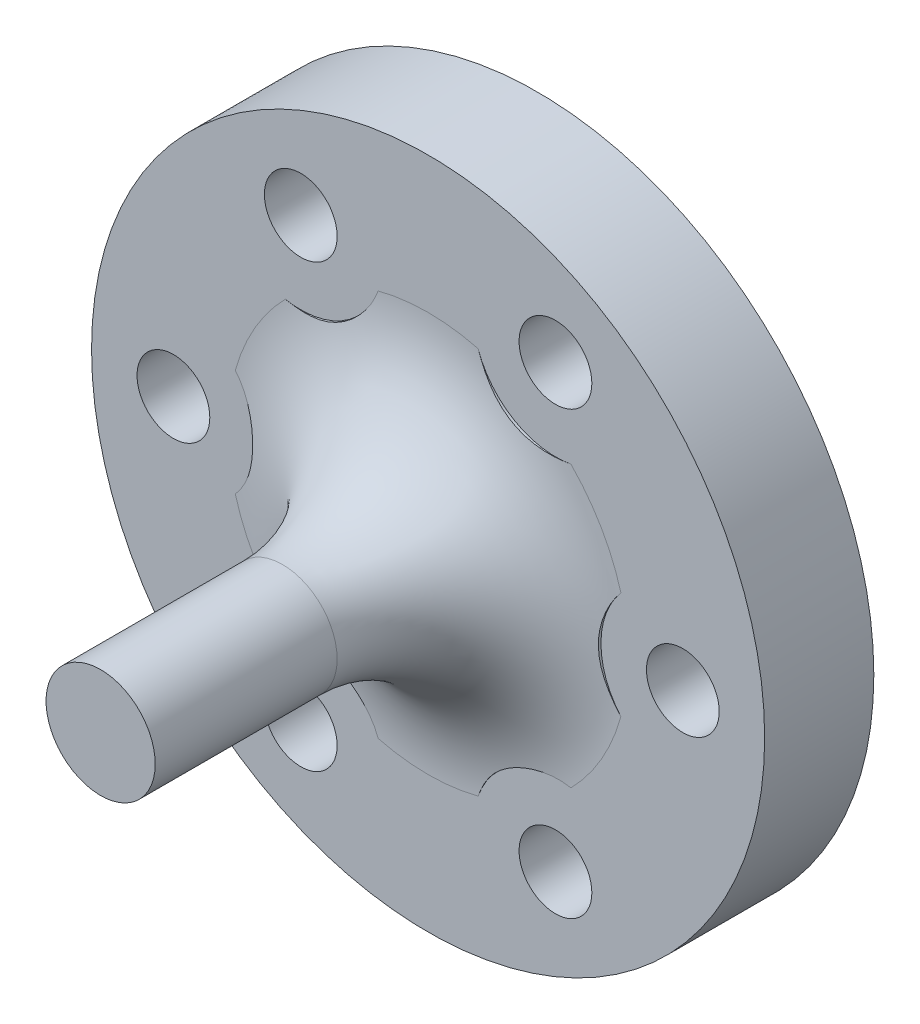
ISO-10303-21;
HEADER;
FILE_DESCRIPTION(('STEP AP214'),'2;1');
FILE_NAME('part.step','',(''),(''),'','','');
FILE_SCHEMA(('AUTOMOTIVE_DESIGN { 1 0 10303 214 1 1 1 1 }'));
ENDSEC;
DATA;
#1=APPLICATION_CONTEXT('core data for automotive mechanical design processes');
#2=APPLICATION_PROTOCOL_DEFINITION('international standard','automotive_design',2000,#1);
#3=PRODUCT_CONTEXT('',#1,'mechanical');
#4=PRODUCT('Part','Part','',(#3));
#5=PRODUCT_RELATED_PRODUCT_CATEGORY('part','',(#4));
#6=PRODUCT_DEFINITION_FORMATION('','',#4);
#7=PRODUCT_DEFINITION_CONTEXT('part definition',#1,'design');
#8=PRODUCT_DEFINITION('design','',#6,#7);
#9=PRODUCT_DEFINITION_SHAPE('','',#8);
#10=(LENGTH_UNIT() NAMED_UNIT(*) SI_UNIT(.MILLI.,.METRE.));
#11=(NAMED_UNIT(*) PLANE_ANGLE_UNIT() SI_UNIT($,.RADIAN.));
#12=(NAMED_UNIT(*) SI_UNIT($,.STERADIAN.) SOLID_ANGLE_UNIT());
#13=UNCERTAINTY_MEASURE_WITH_UNIT(LENGTH_MEASURE(1.E-05),#10,'distance_accuracy_value','');
#14=(GEOMETRIC_REPRESENTATION_CONTEXT(3) GLOBAL_UNCERTAINTY_ASSIGNED_CONTEXT((#13)) GLOBAL_UNIT_ASSIGNED_CONTEXT((#10,
#11,#12)) REPRESENTATION_CONTEXT('',''));
#15=CARTESIAN_POINT('',(0.,0.,0.));
#16=DIRECTION('',(0.,0.,1.));
#17=DIRECTION('',(1.,0.,0.));
#18=AXIS2_PLACEMENT_3D('',#15,#16,#17);
#19=CARTESIAN_POINT('',(0.,0.,14.));
#20=DIRECTION('',(0.,0.,1.));
#21=DIRECTION('',(1.,0.,0.));
#22=AXIS2_PLACEMENT_3D('',#19,#20,#21);
#23=TOROIDAL_SURFACE('',#22,11.,8.);
#24=CARTESIAN_POINT('',(0.,0.,14.));
#25=DIRECTION('',(0.,0.,1.));
#26=DIRECTION('',(1.,0.,0.));
#27=AXIS2_PLACEMENT_3D('',#24,#25,#26);
#28=CIRCLE('',#27,3.);
#29=CARTESIAN_POINT('',(3.,0.,14.));
#30=VERTEX_POINT('',#29);
#31=EDGE_CURVE('E132',#30,#30,#28,.T.);
#32=ORIENTED_EDGE('',*,*,#31,.F.);
#33=EDGE_LOOP('',(#32));
#34=FACE_BOUND('',#33,.T.);
#35=CARTESIAN_POINT('',(-11.0001999999998,10.0631909434061,7.01993479948627));
#36=CARTESIAN_POINT('',(-10.9494264124712,9.96463682163105,6.96169340146558));
#37=CARTESIAN_POINT('',(-10.8945383605836,9.86707400444641,6.90528345397473));
#38=CARTESIAN_POINT('',(-10.7764532518473,9.67463319364013,6.79652438119807));
#39=CARTESIAN_POINT('',(-10.7132498095846,9.57975733208057,6.74417842628928));
#40=CARTESIAN_POINT('',(-10.5782294989667,9.39312894186151,6.64381160764316));
#41=CARTESIAN_POINT('',(-10.5063752029488,9.30139236329559,6.59581123529545));
#42=CARTESIAN_POINT('',(-10.3544051656952,9.12239896591814,6.50485031696125));
#43=CARTESIAN_POINT('',(-10.2742913967551,9.03514108504984,6.46188857300459));
#44=CARTESIAN_POINT('',(-10.1056029574734,8.86558247842679,6.38118510661778));
#45=CARTESIAN_POINT('',(-10.0169871973044,8.78330932132801,6.34347114075104));
#46=CARTESIAN_POINT('',(-9.83207157533709,8.62518916081575,6.27385985212408));
#47=CARTESIAN_POINT('',(-9.73577237457533,8.54934160573764,6.24196202975226));
#48=CARTESIAN_POINT('',(-9.53634628390853,8.40521005328183,6.18427217205492));
#49=CARTESIAN_POINT('',(-9.43323761218836,8.33690708426461,6.15846462715958));
#50=CARTESIAN_POINT('',(-9.22075288700532,8.20853397885126,6.11291648236378));
#51=CARTESIAN_POINT('',(-9.11137750414056,8.14846296388191,6.09317523474471));
#52=CARTESIAN_POINT('',(-8.89750957578134,8.04239789602259,6.06116443542952));
#53=CARTESIAN_POINT('',(-8.79348194963406,7.99561955554907,6.04837753050059));
#54=CARTESIAN_POINT('',(-8.5817346591249,7.90995607816692,6.02746344237483));
#55=CARTESIAN_POINT('',(-8.47401382356204,7.87107347275026,6.01933775211487));
#56=CARTESIAN_POINT('',(-8.25565941551487,7.80157323416832,6.0073701332852));
#57=CARTESIAN_POINT('',(-8.14502472151908,7.77095883591157,6.00352987954324));
#58=CARTESIAN_POINT('',(-7.92166365113584,7.71825481410896,5.99961325188039));
#59=CARTESIAN_POINT('',(-7.80893651389783,7.69616835774164,5.99953827500793));
#60=CARTESIAN_POINT('',(-7.47004732152016,7.64316704419308,6.00402431957029));
#61=CARTESIAN_POINT('',(-7.24182026468586,7.62507998139504,6.01323761632444));
#62=CARTESIAN_POINT('',(-6.78561738554907,7.6236731456313,6.038092838136));
#63=CARTESIAN_POINT('',(-6.55764168931558,7.64036639330784,6.05373716900813));
#64=CARTESIAN_POINT('',(-6.20947405427308,7.69259094118926,6.07775651141392));
#65=CARTESIAN_POINT('',(-6.08737519547192,7.71611619128904,6.08620462795984));
#66=CARTESIAN_POINT('',(-5.84549169936305,7.77320239967545,6.1020512693898));
#67=CARTESIAN_POINT('',(-5.72570630013189,7.80675999173071,6.10945014510814));
#68=CARTESIAN_POINT('',(-5.48926754275764,7.88370211807641,6.12233759782229));
#69=CARTESIAN_POINT('',(-5.37261333104627,7.92708394319498,6.12782670040872));
#70=CARTESIAN_POINT('',(-5.14322078020805,8.02339935554509,6.13626139696227));
#71=CARTESIAN_POINT('',(-5.03048230747868,8.07633261650523,6.13920707779129));
#72=CARTESIAN_POINT('',(-4.80930324162474,8.19161331449289,6.14221690821589));
#73=CARTESIAN_POINT('',(-4.70088185711465,8.25399792964961,6.14226936549766));
#74=CARTESIAN_POINT('',(-4.48963429765387,8.38755456749725,6.13945757813633));
#75=CARTESIAN_POINT('',(-4.38680825001812,8.45872679001891,6.13659326715501));
#76=CARTESIAN_POINT('',(-4.18741757865615,8.60938742070654,6.12827943277813));
#77=CARTESIAN_POINT('',(-4.09085803445245,8.68888244211004,6.12282784120864));
#78=CARTESIAN_POINT('',(-3.90477770337695,8.85553100301752,6.10998559378254));
#79=CARTESIAN_POINT('',(-3.81525683937263,8.94268445857534,6.10259495917854));
#80=CARTESIAN_POINT('',(-3.56038180963211,9.21238222531372,6.07898728665461));
#81=CARTESIAN_POINT('',(-3.40591888389211,9.40528766729484,6.06117485459986));
#82=CARTESIAN_POINT('',(-3.13071732813855,9.8136919172711,6.02937607782936));
#83=CARTESIAN_POINT('',(-3.00992445280466,10.0291536056385,6.01538357963299));
#84=CARTESIAN_POINT('',(-2.85251325935254,10.3733892191976,6.00301981580388));
#85=CARTESIAN_POINT('',(-2.80280701952782,10.4961494152996,6.00041638017595));
#86=CARTESIAN_POINT('',(-2.71440440759439,10.7455204856575,5.99967312096967));
#87=CARTESIAN_POINT('',(-2.67570339842065,10.8721297131547,6.00153141431124));
#88=CARTESIAN_POINT('',(-2.6426758133152,11.0002,6.00613261984899));
#89=B_SPLINE_CURVE_WITH_KNOTS('',3,(#35,#36,#37,#38,#39,#40,#41,#42,#43,#44,#45,#46,#47,#48,#49,
#50,#51,#52,#53,#54,#55,#56,#57,#58,#59,#60,#61,#62,#63,#64,#65,#66,#67,#68,#69,#70,#71,#72,#73,
#74,#75,#76,#77,#78,#79,#80,#81,#82,#83,#84,#85,#86,#87,#88),.UNSPECIFIED.,.F.,.F.,(4,2,2,2,2,2,
2,2,2,2,2,2,2,2,2,2,2,2,2,2,2,2,2,2,2,2,4),(0.,0.375664358738734,0.751618893640772,
1.12926275256162,1.50681664113115,1.88629719010377,2.26574512600703,2.64421606837165,
3.02264658608915,3.36655141114286,3.71056632379558,4.05471563679547,4.39899264019535,
5.08332326649196,5.767910130446,6.14143626489929,6.51483720756188,6.88813530472828,
7.26142065266584,7.63621443950754,8.01101675075411,8.38611917067361,8.76121747950629,
9.50100044136487,10.2395845688599,10.6364540925034,11.0331561461553),.UNSPECIFIED.);
#90=CARTESIAN_POINT('',(-7.85026187465239,7.70541293503335,6.));
#91=VERTEX_POINT('',#90);
#92=CARTESIAN_POINT('',(-2.7479524110619,10.6512326773261,6.));
#93=VERTEX_POINT('',#92);
#94=EDGE_CURVE('E11',#91,#93,#89,.T.);
#95=ORIENTED_EDGE('',*,*,#94,.F.);
#96=CARTESIAN_POINT('',(0.,0.,6.));
#97=DIRECTION('',(0.,0.,1.));
#98=DIRECTION('',(1.,0.,0.));
#99=AXIS2_PLACEMENT_3D('',#96,#97,#98);
#100=CIRCLE('',#99,11.);
#101=CARTESIAN_POINT('',(-10.5982142857143,2.94581974229274,6.));
#102=VERTEX_POINT('',#101);
#103=EDGE_CURVE('E112',#102,#91,#100,.F.);
#104=ORIENTED_EDGE('',*,*,#103,.F.);
#105=CARTESIAN_POINT('',(-11.0002,-3.35428084095533,6.01565553942992));
#106=CARTESIAN_POINT('',(-10.908557658129,-3.27235164073608,6.00863923396749));
#107=CARTESIAN_POINT('',(-10.8202153173517,-3.18656094862768,6.0041721559842));
#108=CARTESIAN_POINT('',(-10.6508466346007,-3.00803088928401,5.9995867248531));
#109=CARTESIAN_POINT('',(-10.5698155868126,-2.91529606291437,5.99946555431534));
#110=CARTESIAN_POINT('',(-10.4158560373803,-2.72378164954471,6.00281090754908));
#111=CARTESIAN_POINT('',(-10.3429079460538,-2.62501761862062,6.00626853749939));
#112=CARTESIAN_POINT('',(-10.2053679014292,-2.42194257087276,6.01584907408368));
#113=CARTESIAN_POINT('',(-10.1407771502611,-2.31763075908765,6.02197236359773));
#114=CARTESIAN_POINT('',(-10.020472499183,-2.10435894908542,6.03589030701521));
#115=CARTESIAN_POINT('',(-9.96474345399588,-1.99540729379734,6.04368205472323));
#116=CARTESIAN_POINT('',(-9.86235491003581,-1.77336954342666,6.05992618690926));
#117=CARTESIAN_POINT('',(-9.81569559833547,-1.66028336312239,6.06837858500883));
#118=CARTESIAN_POINT('',(-9.73170828720146,-1.43060953842809,6.08494749094457));
#119=CARTESIAN_POINT('',(-9.69438482779315,-1.31402022121204,6.09306383376233));
#120=CARTESIAN_POINT('',(-9.62935738028934,-1.07816512519766,6.10803045231689));
#121=CARTESIAN_POINT('',(-9.60164900191833,-0.958900594464411,6.11488130521021));
#122=CARTESIAN_POINT('',(-9.55522642909156,-0.714170321963655,6.12675685953058));
#123=CARTESIAN_POINT('',(-9.53686340032958,-0.588634119003828,6.13170874161358));
#124=CARTESIAN_POINT('',(-9.51079877573138,-0.336378035549548,6.13883664267492));
#125=CARTESIAN_POINT('',(-9.50309727113823,-0.209658144934246,6.14101263789676));
#126=CARTESIAN_POINT('',(-9.49842796757007,0.0439717814859325,6.14232485151881));
#127=CARTESIAN_POINT('',(-9.50145814753563,0.17088177698948,6.1414616422816));
#128=CARTESIAN_POINT('',(-9.51821938673164,0.423936187986471,6.13680121998517));
#129=CARTESIAN_POINT('',(-9.53195033043101,0.55008061173061,6.13300403860266));
#130=CARTESIAN_POINT('',(-9.5693286828482,0.796316030642446,6.12311053857902));
#131=CARTESIAN_POINT('',(-9.59261614236035,0.916465360378785,6.11709841055003));
#132=CARTESIAN_POINT('',(-9.64886866314068,1.15438267552259,6.10344417479777));
#133=CARTESIAN_POINT('',(-9.68183398672618,1.27215059628977,6.09580202289445));
#134=CARTESIAN_POINT('',(-9.75722228118123,1.50458173078568,6.0797463855267));
#135=CARTESIAN_POINT('',(-9.79964655116262,1.6192445156202,6.07133279420469));
#136=CARTESIAN_POINT('',(-9.89369038515137,1.84476309798481,6.05470531120143));
#137=CARTESIAN_POINT('',(-9.9453110706394,1.95561842923629,6.04649144401505));
#138=CARTESIAN_POINT('',(-10.0639073286003,2.18534839758758,6.0304038395356));
#139=CARTESIAN_POINT('',(-10.1319665715799,2.30367646335733,6.02267819362034));
#140=CARTESIAN_POINT('',(-10.2786229514881,2.53376589927483,6.01012276102045));
#141=CARTESIAN_POINT('',(-10.3572191859884,2.64552783059382,6.00529272653823));
#142=CARTESIAN_POINT('',(-10.524586135496,2.86185853142601,5.99981217253035));
#143=CARTESIAN_POINT('',(-10.6133883943648,2.96640330972962,5.99917498566005));
#144=CARTESIAN_POINT('',(-10.8001531773599,3.16699424020976,6.00318179092198));
#145=CARTESIAN_POINT('',(-10.8981227804402,3.26303371139824,6.00782989572068));
#146=CARTESIAN_POINT('',(-11.0002,3.35428084095533,6.01565553942992));
#147=B_SPLINE_CURVE_WITH_KNOTS('',3,(#105,#106,#107,#108,#109,#110,#111,#112,#113,#114,#115,
#116,#117,#118,#119,#120,#121,#122,#123,#124,#125,#126,#127,#128,#129,#130,#131,#132,#133,#134,
#135,#136,#137,#138,#139,#140,#141,#142,#143,#144,#145,#146),.UNSPECIFIED.,.F.,.F.,(4,2,2,2,2,2,
2,2,2,2,2,2,2,2,2,2,2,2,2,2,4),(0.,0.369202054733967,0.738164756699318,1.10621273104094,
1.47431358713572,1.84177840982064,2.20925081104188,2.5769015681936,2.94438423330895,
3.32481030002508,3.70523962246946,4.08559730384225,4.46595087873075,4.83313017152824,
5.20031941759421,5.56755912531135,5.93484364771722,6.34442319857105,6.75396769384925,
7.16481385528365,7.57597992909056),.UNSPECIFIED.);
#148=CARTESIAN_POINT('',(-10.5982142857143,-2.94581974229274,6.));
#149=VERTEX_POINT('',#148);
#150=EDGE_CURVE('E101',#149,#102,#147,.T.);
#151=ORIENTED_EDGE('',*,*,#150,.F.);
#152=CARTESIAN_POINT('',(-7.85026187465242,-7.70541293503332,6.));
#153=VERTEX_POINT('',#152);
#154=EDGE_CURVE('E111',#153,#149,#100,.F.);
#155=ORIENTED_EDGE('',*,*,#154,.F.);
#156=CARTESIAN_POINT('',(-2.64267581331515,-11.0002,6.00613261984899));
#157=CARTESIAN_POINT('',(-2.67368032368149,-10.8799469062791,6.00181013883565));
#158=CARTESIAN_POINT('',(-2.70971153075585,-10.7609381639375,5.99990935353809));
#159=CARTESIAN_POINT('',(-2.79145806330339,-10.5263745205892,6.00009621564333));
#160=CARTESIAN_POINT('',(-2.83716741652336,-10.4108175394989,6.00218140969379));
#161=CARTESIAN_POINT('',(-2.93787271429274,-10.1841237769271,6.00947718465504));
#162=CARTESIAN_POINT('',(-2.99285618153707,-10.0729813011962,6.01468359004332));
#163=CARTESIAN_POINT('',(-3.1117494319215,-9.85568978729968,6.02722577895314));
#164=CARTESIAN_POINT('',(-3.17566047686113,-9.74954145783299,6.03456186363604));
#165=CARTESIAN_POINT('',(-3.31187120167521,-9.54308068973264,6.05030909000831));
#166=CARTESIAN_POINT('',(-3.38415862983635,-9.4427600420131,6.05871866334586));
#167=CARTESIAN_POINT('',(-3.53673864199308,-9.24840643156232,6.07557405655808));
#168=CARTESIAN_POINT('',(-3.61703123082249,-9.15437347262789,6.08401987645463));
#169=CARTESIAN_POINT('',(-3.78510513431232,-8.97321085727108,6.09995558686991));
#170=CARTESIAN_POINT('',(-3.87288451233624,-8.88607942678355,6.10744572335521));
#171=CARTESIAN_POINT('',(-4.05539450478489,-8.7192739702557,6.12061268582741));
#172=CARTESIAN_POINT('',(-4.15012511569218,-8.63959994044186,6.12628951273187));
#173=CARTESIAN_POINT('',(-4.34798865580128,-8.48666411890726,6.13527229495151));
#174=CARTESIAN_POINT('',(-4.45125743391806,-8.41357473629303,6.13852526015663));
#175=CARTESIAN_POINT('',(-4.66362016776085,-8.27632851856801,6.14206756423215));
#176=CARTESIAN_POINT('',(-4.77271417342071,-8.21217176004469,6.14235687769404));
#177=CARTESIAN_POINT('',(-4.99590574879639,-8.093276825993,6.13993695906986));
#178=CARTESIAN_POINT('',(-5.11000402720296,-8.03853998992663,6.13722730095266));
#179=CARTESIAN_POINT('',(-5.3423199686766,-7.93889602320676,6.12913501651295));
#180=CARTESIAN_POINT('',(-5.46053761825073,-7.89398886035985,6.12375239894489));
#181=CARTESIAN_POINT('',(-5.69639573469151,-7.8155779814631,6.11116425367034));
#182=CARTESIAN_POINT('',(-5.81393404015254,-7.78175585775348,6.10402243939731));
#183=CARTESIAN_POINT('',(-6.05134311122368,-7.72378906745947,6.08863815769859));
#184=CARTESIAN_POINT('',(-6.171214656015,-7.69964769396701,6.08039531700671));
#185=CARTESIAN_POINT('',(-6.41254043004618,-7.6611926439537,6.06374824630023));
#186=CARTESIAN_POINT('',(-6.53399501254122,-7.64688120061131,6.05534398005823));
#187=CARTESIAN_POINT('',(-6.77772105255312,-7.62818729850168,6.03938287389729));
#188=CARTESIAN_POINT('',(-6.89999249931509,-7.62380470926768,6.03182602284443));
#189=CARTESIAN_POINT('',(-7.14914434958447,-7.62503959247852,6.01832556944128));
#190=CARTESIAN_POINT('',(-7.27602708545671,-7.63103494028374,6.01245239702331));
#191=CARTESIAN_POINT('',(-7.52889316039734,-7.65374288748984,6.0037857829426));
#192=CARTESIAN_POINT('',(-7.65487683460013,-7.67045125707444,6.00099112697412));
#193=CARTESIAN_POINT('',(-7.90494989437404,-7.71446060501428,5.99944707682727));
#194=CARTESIAN_POINT('',(-8.02904019735352,-7.74175627232807,6.000695656693));
#195=CARTESIAN_POINT('',(-8.274335226014,-7.8066986201942,6.0080507809841));
#196=CARTESIAN_POINT('',(-8.39554019549346,-7.8443444228066,6.01415691345554));
#197=CARTESIAN_POINT('',(-8.62671088554,-7.92698179927394,6.03131392659439));
#198=CARTESIAN_POINT('',(-8.73691118424372,-7.97138515947829,6.04204043688999));
#199=CARTESIAN_POINT('',(-8.95293882795344,-8.06848902497146,6.06867940488166));
#200=CARTESIAN_POINT('',(-9.05876639409674,-8.12118911002936,6.08459159996531));
#201=CARTESIAN_POINT('',(-9.26521832976464,-8.23428736412145,6.12178843761109));
#202=CARTESIAN_POINT('',(-9.36584358442767,-8.29468421750274,6.14307216259489));
#203=CARTESIAN_POINT('',(-9.56116659965613,-8.42245549651421,6.19102514390552));
#204=CARTESIAN_POINT('',(-9.65586456474663,-8.48982968117377,6.21769421427308));
#205=CARTESIAN_POINT('',(-9.91965108145998,-8.69319361165421,6.30228666549102));
#206=CARTESIAN_POINT('',(-10.0805267423284,-8.83720481752798,6.36700295619519));
#207=CARTESIAN_POINT('',(-10.3764383317776,-9.14192898127239,6.513591662772));
#208=CARTESIAN_POINT('',(-10.5114654067167,-9.3026476327859,6.59546993691149));
#209=CARTESIAN_POINT('',(-10.7032107361214,-9.56498399747255,6.73607496654736));
#210=CARTESIAN_POINT('',(-10.7688836057982,-9.66282331365052,6.78993189873641));
#211=CARTESIAN_POINT('',(-10.8911984068356,-9.86115056567602,6.90186077353181));
#212=CARTESIAN_POINT('',(-10.947869114029,-9.96162881464843,6.95991838536034));
#213=CARTESIAN_POINT('',(-11.0001999999998,-10.0631909434061,7.01993479948624));
#214=B_SPLINE_CURVE_WITH_KNOTS('',3,(#156,#157,#158,#159,#160,#161,#162,#163,#164,#165,#166,
#167,#168,#169,#170,#171,#172,#173,#174,#175,#176,#177,#178,#179,#180,#181,#182,#183,#184,#185,
#186,#187,#188,#189,#190,#191,#192,#193,#194,#195,#196,#197,#198,#199,#200,#201,#202,#203,#204,
#205,#206,#207,#208,#209,#210,#211,#212,#213),.UNSPECIFIED.,.F.,.F.,(4,2,2,2,2,2,2,2,2,2,2,2,2,
2,2,2,2,2,2,2,2,2,2,2,2,2,2,2,4),(0.,0.372604021092551,0.744978779927911,1.11685648806541,
1.48878680966684,1.86017983563731,2.23157308587119,2.60287055607248,2.97416783839275,
3.35336167607418,3.7325587647274,4.11180972868327,4.49105945052653,4.8581961930034,
5.2254577183224,5.59280265110026,5.96014275687801,6.34114109373576,6.7219890937923,
7.10264629077272,7.48327120884158,7.84067668148432,8.19806405728273,8.55539042453783,
8.91270445520422,9.58577604294755,10.2590777598726,10.6473901797682,11.0344352152354),.UNSPECIFIED.);
#215=CARTESIAN_POINT('',(-2.74795241106184,-10.6512326773261,6.));
#216=VERTEX_POINT('',#215);
#217=EDGE_CURVE('E114',#216,#153,#214,.T.);
#218=ORIENTED_EDGE('',*,*,#217,.F.);
#219=CARTESIAN_POINT('',(2.74795241106181,-10.6512326773261,6.));
#220=VERTEX_POINT('',#219);
#221=EDGE_CURVE('E123',#220,#216,#100,.F.);
#222=ORIENTED_EDGE('',*,*,#221,.F.);
#223=CARTESIAN_POINT('',(11.0001999999998,-10.0631909434064,7.01993479948639));
#224=CARTESIAN_POINT('',(10.9494264124713,-9.96463682163136,6.96169340146569));
#225=CARTESIAN_POINT('',(10.8945383605837,-9.86707400444672,6.90528345397484));
#226=CARTESIAN_POINT('',(10.7764532518474,-9.67463319364042,6.79652438119817));
#227=CARTESIAN_POINT('',(10.7132498095846,-9.57975733208086,6.74417842628938));
#228=CARTESIAN_POINT('',(10.5782294989667,-9.39312894186179,6.64381160764325));
#229=CARTESIAN_POINT('',(10.5063752029488,-9.30139236329586,6.59581123529553));
#230=CARTESIAN_POINT('',(10.3544051656953,-9.1223989659184,6.50485031696132));
#231=CARTESIAN_POINT('',(10.2742913967551,-9.0351410850501,6.46188857300467));
#232=CARTESIAN_POINT('',(10.1056029574734,-8.86558247842703,6.38118510661784));
#233=CARTESIAN_POINT('',(10.0169871973045,-8.78330932132825,6.3434711407511));
#234=CARTESIAN_POINT('',(9.83207157533716,-8.62518916081598,6.27385985212413));
#235=CARTESIAN_POINT('',(9.7357723745754,-8.54934160573786,6.24196202975231));
#236=CARTESIAN_POINT('',(9.5363462839086,-8.40521005328204,6.18427217205496));
#237=CARTESIAN_POINT('',(9.43323761218843,-8.33690708426481,6.15846462715962));
#238=CARTESIAN_POINT('',(9.2207528870054,-8.20853397885145,6.11291648236382));
#239=CARTESIAN_POINT('',(9.11137750414064,-8.14846296388209,6.09317523474474));
#240=CARTESIAN_POINT('',(8.89750957578142,-8.04239789602276,6.06116443542954));
#241=CARTESIAN_POINT('',(8.79348194963414,-7.99561955554924,6.04837753050061));
#242=CARTESIAN_POINT('',(8.58173465912498,-7.90995607816707,6.02746344237485));
#243=CARTESIAN_POINT('',(8.47401382356212,-7.87107347275041,6.01933775211488));
#244=CARTESIAN_POINT('',(8.25565941551495,-7.80157323416845,6.00737013328521));
#245=CARTESIAN_POINT('',(8.14502472151916,-7.7709588359117,6.00352987954325));
#246=CARTESIAN_POINT('',(7.92166365113592,-7.71825481410908,5.99961325188039));
#247=CARTESIAN_POINT('',(7.80893651389792,-7.69616835774176,5.99953827500793));
#248=CARTESIAN_POINT('',(7.47004732152025,-7.64316704419318,6.00402431957029));
#249=CARTESIAN_POINT('',(7.24182026468595,-7.62507998139513,6.01323761632443));
#250=CARTESIAN_POINT('',(6.78561738554917,-7.62367314563137,6.03809283813599));
#251=CARTESIAN_POINT('',(6.55764168931568,-7.6403663933079,6.05373716900811));
#252=CARTESIAN_POINT('',(6.20947405427318,-7.6925909411893,6.0777565114139));
#253=CARTESIAN_POINT('',(6.08737519547202,-7.71611619128908,6.08620462795983));
#254=CARTESIAN_POINT('',(5.84549169936315,-7.77320239967547,6.10205126938979));
#255=CARTESIAN_POINT('',(5.72570630013199,-7.80675999173073,6.10945014510813));
#256=CARTESIAN_POINT('',(5.48926754275774,-7.88370211807641,6.12233759782228));
#257=CARTESIAN_POINT('',(5.37261333104637,-7.92708394319498,6.12782670040871));
#258=CARTESIAN_POINT('',(5.14322078020814,-8.02339935554508,6.13626139696226));
#259=CARTESIAN_POINT('',(5.03048230747877,-8.07633261650521,6.13920707779129));
#260=CARTESIAN_POINT('',(4.80930324162482,-8.19161331449286,6.14221690821589));
#261=CARTESIAN_POINT('',(4.70088185711474,-8.25399792964957,6.14226936549766));
#262=CARTESIAN_POINT('',(4.48963429765394,-8.3875545674972,6.13945757813634));
#263=CARTESIAN_POINT('',(4.38680825001819,-8.45872679001886,6.13659326715501));
#264=CARTESIAN_POINT('',(4.18741757865622,-8.60938742070648,6.12827943277814));
#265=CARTESIAN_POINT('',(4.09085803445251,-8.68888244210997,6.12282784120865));
#266=CARTESIAN_POINT('',(3.904777703377,-8.85553100301745,6.10998559378255));
#267=CARTESIAN_POINT('',(3.81525683937267,-8.94268445857526,6.10259495917855));
#268=CARTESIAN_POINT('',(3.56038180963214,-9.21238222531363,6.07898728665462));
#269=CARTESIAN_POINT('',(3.40591888389213,-9.40528766729473,6.06117485459987));
#270=CARTESIAN_POINT('',(3.13071732813856,-9.81369191727099,6.02937607782937));
#271=CARTESIAN_POINT('',(3.00992445280465,-10.0291536056384,6.015383579633));
#272=CARTESIAN_POINT('',(2.85251325935251,-10.3733892191975,6.00301981580388));
#273=CARTESIAN_POINT('',(2.80280701952778,-10.4961494152995,6.00041638017596));
#274=CARTESIAN_POINT('',(2.71440440759432,-10.7455204856574,5.99967312096967));
#275=CARTESIAN_POINT('',(2.67570339842057,-10.8721297131547,6.00153141431124));
#276=CARTESIAN_POINT('',(2.64267581331511,-11.0002,6.00613261984899));
#277=B_SPLINE_CURVE_WITH_KNOTS('',3,(#223,#224,#225,#226,#227,#228,#229,#230,#231,#232,#233,
#234,#235,#236,#237,#238,#239,#240,#241,#242,#243,#244,#245,#246,#247,#248,#249,#250,#251,#252,
#253,#254,#255,#256,#257,#258,#259,#260,#261,#262,#263,#264,#265,#266,#267,#268,#269,#270,#271,
#272,#273,#274,#275,#276),.UNSPECIFIED.,.F.,.F.,(4,2,2,2,2,2,2,2,2,2,2,2,2,2,2,2,2,2,2,2,2,2,2,
2,2,2,4),(0.,0.375664358738744,0.75161889364079,1.12926275256165,1.50681664113119,
1.88629719010381,2.26574512600708,2.64421606837171,3.02264658608922,3.36655141114293,
3.71056632379566,4.05471563679555,4.39899264019544,5.08332326649204,5.76791013044607,
6.14143626489935,6.51483720756195,6.88813530472834,7.2614206526659,7.6362144395076,
8.01101675075417,8.38611917067367,8.76121747950635,9.50100044136493,10.2395845688599,
10.6364540925036,11.0331561461555),.UNSPECIFIED.);
#278=CARTESIAN_POINT('',(7.85026187465231,-7.70541293503343,6.));
#279=VERTEX_POINT('',#278);
#280=EDGE_CURVE('E281',#279,#220,#277,.T.);
#281=ORIENTED_EDGE('',*,*,#280,.F.);
#282=CARTESIAN_POINT('',(10.5982142857143,-2.94581974229281,6.));
#283=VERTEX_POINT('',#282);
#284=EDGE_CURVE('E115',#283,#279,#100,.F.);
#285=ORIENTED_EDGE('',*,*,#284,.F.);
#286=CARTESIAN_POINT('',(11.0002,3.35428084095523,6.01565553942991));
#287=CARTESIAN_POINT('',(10.908557658129,3.27235164073598,6.00863923396749));
#288=CARTESIAN_POINT('',(10.8202153173517,3.18656094862758,6.00417215598419));
#289=CARTESIAN_POINT('',(10.6508466346007,3.00803088928391,5.9995867248531));
#290=CARTESIAN_POINT('',(10.5698155868126,2.91529606291427,5.99946555431534));
#291=CARTESIAN_POINT('',(10.4158560373803,2.72378164954461,6.00281090754908));
#292=CARTESIAN_POINT('',(10.3429079460538,2.62501761862052,6.00626853749939));
#293=CARTESIAN_POINT('',(10.2053679014292,2.42194257087266,6.01584907408368));
#294=CARTESIAN_POINT('',(10.1407771502611,2.31763075908755,6.02197236359773));
#295=CARTESIAN_POINT('',(10.020472499183,2.10435894908532,6.03589030701521));
#296=CARTESIAN_POINT('',(9.96474345399588,1.99540729379723,6.04368205472323));
#297=CARTESIAN_POINT('',(9.86235491003581,1.77336954342656,6.05992618690927));
#298=CARTESIAN_POINT('',(9.81569559833547,1.66028336312229,6.06837858500883));
#299=CARTESIAN_POINT('',(9.73170828720146,1.43060953842799,6.08494749094457));
#300=CARTESIAN_POINT('',(9.69438482779315,1.31402022121194,6.09306383376233));
#301=CARTESIAN_POINT('',(9.62935738028934,1.07816512519755,6.10803045231689));
#302=CARTESIAN_POINT('',(9.60164900191834,0.958900594464307,6.11488130521021));
#303=CARTESIAN_POINT('',(9.55522642909156,0.714170321963551,6.12675685953059));
#304=CARTESIAN_POINT('',(9.53686340032958,0.588634119003725,6.13170874161358));
#305=CARTESIAN_POINT('',(9.51079877573138,0.336378035549444,6.13883664267492));
#306=CARTESIAN_POINT('',(9.50309727113823,0.209658144934141,6.14101263789676));
#307=CARTESIAN_POINT('',(9.49842796757007,-0.0439717814860369,6.14232485151881));
#308=CARTESIAN_POINT('',(9.50145814753563,-0.170881776989585,6.1414616422816));
#309=CARTESIAN_POINT('',(9.51821938673164,-0.423936187986575,6.13680121998517));
#310=CARTESIAN_POINT('',(9.53195033043101,-0.550080611730714,6.13300403860265));
#311=CARTESIAN_POINT('',(9.56932868284821,-0.79631603064255,6.12311053857902));
#312=CARTESIAN_POINT('',(9.59261614236035,-0.91646536037889,6.11709841055002));
#313=CARTESIAN_POINT('',(9.64886866314068,-1.1543826755227,6.10344417479777));
#314=CARTESIAN_POINT('',(9.68183398672618,-1.27215059628988,6.09580202289445));
#315=CARTESIAN_POINT('',(9.75722228118124,-1.50458173078578,6.0797463855267));
#316=CARTESIAN_POINT('',(9.79964655116262,-1.61924451562031,6.07133279420469));
#317=CARTESIAN_POINT('',(9.89369038515138,-1.84476309798491,6.05470531120143));
#318=CARTESIAN_POINT('',(9.94531107063941,-1.95561842923639,6.04649144401505));
#319=CARTESIAN_POINT('',(10.0639073286003,-2.18534839758768,6.0304038395356));
#320=CARTESIAN_POINT('',(10.1319665715799,-2.30367646335743,6.02267819362034));
#321=CARTESIAN_POINT('',(10.2786229514881,-2.53376589927493,6.01012276102045));
#322=CARTESIAN_POINT('',(10.3572191859884,-2.64552783059392,6.00529272653823));
#323=CARTESIAN_POINT('',(10.524586135496,-2.86185853142611,5.99981217253035));
#324=CARTESIAN_POINT('',(10.6133883943648,-2.96640330972972,5.99917498566005));
#325=CARTESIAN_POINT('',(10.8001531773599,-3.16699424020986,6.00318179092198));
#326=CARTESIAN_POINT('',(10.8981227804402,-3.26303371139833,6.00782989572068));
#327=CARTESIAN_POINT('',(11.0002,-3.35428084095543,6.01565553942992));
#328=B_SPLINE_CURVE_WITH_KNOTS('',3,(#286,#287,#288,#289,#290,#291,#292,#293,#294,#295,#296,
#297,#298,#299,#300,#301,#302,#303,#304,#305,#306,#307,#308,#309,#310,#311,#312,#313,#314,#315,
#316,#317,#318,#319,#320,#321,#322,#323,#324,#325,#326,#327),.UNSPECIFIED.,.F.,.F.,(4,2,2,2,2,2,
2,2,2,2,2,2,2,2,2,2,2,2,2,2,4),(0.,0.369202054733966,0.738164756699317,1.10621273104094,
1.47431358713572,1.84177840982064,2.20925081104188,2.5769015681936,2.94438423330895,
3.32481030002508,3.70523962246946,4.08559730384226,4.46595087873075,4.83313017152824,
5.20031941759422,5.56755912531136,5.93484364771723,6.34442319857105,6.75396769384925,
7.16481385528364,7.57597992909056),.UNSPECIFIED.);
#329=CARTESIAN_POINT('',(10.5982142857143,2.94581974229266,6.));
#330=VERTEX_POINT('',#329);
#331=EDGE_CURVE('E278',#330,#283,#328,.T.);
#332=ORIENTED_EDGE('',*,*,#331,.F.);
#333=CARTESIAN_POINT('',(7.85026187465242,7.70541293503332,6.));
#334=VERTEX_POINT('',#333);
#335=EDGE_CURVE('E131',#334,#330,#100,.F.);
#336=ORIENTED_EDGE('',*,*,#335,.F.);
#337=CARTESIAN_POINT('',(2.64267581331525,11.0002,6.00613261984899));
#338=CARTESIAN_POINT('',(2.67368032368159,10.8799469062791,6.00181013883565));
#339=CARTESIAN_POINT('',(2.70971153075595,10.7609381639375,5.99990935353809));
#340=CARTESIAN_POINT('',(2.7914580633035,10.5263745205892,6.00009621564333));
#341=CARTESIAN_POINT('',(2.83716741652346,10.4108175394989,6.00218140969379));
#342=CARTESIAN_POINT('',(2.93787271429284,10.1841237769271,6.00947718465504));
#343=CARTESIAN_POINT('',(2.99285618153716,10.0729813011962,6.01468359004332));
#344=CARTESIAN_POINT('',(3.11174943192159,9.85568978729969,6.02722577895313));
#345=CARTESIAN_POINT('',(3.17566047686122,9.749541457833,6.03456186363604));
#346=CARTESIAN_POINT('',(3.3118712016753,9.54308068973265,6.0503090900083));
#347=CARTESIAN_POINT('',(3.38415862983644,9.44276004201312,6.05871866334586));
#348=CARTESIAN_POINT('',(3.53673864199316,9.24840643156234,6.07557405655808));
#349=CARTESIAN_POINT('',(3.61703123082258,9.1543734726279,6.08401987645462));
#350=CARTESIAN_POINT('',(3.7851051343124,8.97321085727109,6.0999555868699));
#351=CARTESIAN_POINT('',(3.87288451233632,8.88607942678356,6.1074457233552));
#352=CARTESIAN_POINT('',(4.05539450478497,8.71927397025571,6.12061268582741));
#353=CARTESIAN_POINT('',(4.15012511569226,8.63959994044187,6.12628951273186));
#354=CARTESIAN_POINT('',(4.34798865580135,8.48666411890728,6.13527229495151));
#355=CARTESIAN_POINT('',(4.45125743391814,8.41357473629304,6.13852526015662));
#356=CARTESIAN_POINT('',(4.66362016776092,8.27632851856803,6.14206756423214));
#357=CARTESIAN_POINT('',(4.77271417342078,8.21217176004471,6.14235687769402));
#358=CARTESIAN_POINT('',(4.99590574879645,8.09327682599302,6.13993695906984));
#359=CARTESIAN_POINT('',(5.11000402720302,8.03853998992665,6.13722730095265));
#360=CARTESIAN_POINT('',(5.34231996867665,7.93889602320678,6.12913501651294));
#361=CARTESIAN_POINT('',(5.46053761825079,7.89398886035987,6.12375239894488));
#362=CARTESIAN_POINT('',(5.69639573469157,7.81557798146312,6.11116425367033));
#363=CARTESIAN_POINT('',(5.81393404015259,7.7817558577535,6.1040224393973));
#364=CARTESIAN_POINT('',(6.05134311122373,7.72378906745948,6.08863815769858));
#365=CARTESIAN_POINT('',(6.17121465601505,7.69964769396703,6.0803953170067));
#366=CARTESIAN_POINT('',(6.41254043004623,7.66119264395372,6.06374824630023));
#367=CARTESIAN_POINT('',(6.53399501254126,7.64688120061133,6.05534398005822));
#368=CARTESIAN_POINT('',(6.77772105255316,7.62818729850169,6.03938287389729));
#369=CARTESIAN_POINT('',(6.89999249931513,7.62380470926769,6.03182602284443));
#370=CARTESIAN_POINT('',(7.14914434958451,7.62503959247853,6.01832556944128));
#371=CARTESIAN_POINT('',(7.27602708545675,7.63103494028375,6.01245239702331));
#372=CARTESIAN_POINT('',(7.52889316039738,7.65374288748985,6.0037857829426));
#373=CARTESIAN_POINT('',(7.65487683460016,7.67045125707445,6.00099112697413));
#374=CARTESIAN_POINT('',(7.90494989437407,7.71446060501428,5.99944707682727));
#375=CARTESIAN_POINT('',(8.02904019735355,7.74175627232808,6.000695656693));
#376=CARTESIAN_POINT('',(8.27433522601403,7.8066986201942,6.0080507809841));
#377=CARTESIAN_POINT('',(8.39554019549349,7.8443444228066,6.01415691345555));
#378=CARTESIAN_POINT('',(8.62671088554002,7.92698179927394,6.03131392659439));
#379=CARTESIAN_POINT('',(8.73691118424375,7.97138515947829,6.04204043689));
#380=CARTESIAN_POINT('',(8.95293882795346,8.06848902497146,6.06867940488166));
#381=CARTESIAN_POINT('',(9.05876639409676,8.12118911002936,6.08459159996531));
#382=CARTESIAN_POINT('',(9.26521832976466,8.23428736412145,6.12178843761109));
#383=CARTESIAN_POINT('',(9.36584358442768,8.29468421750273,6.14307216259489));
#384=CARTESIAN_POINT('',(9.56116659965614,8.42245549651421,6.19102514390552));
#385=CARTESIAN_POINT('',(9.65586456474664,8.48982968117376,6.21769421427308));
#386=CARTESIAN_POINT('',(9.91965108145999,8.6931936116542,6.30228666549102));
#387=CARTESIAN_POINT('',(10.0805267423284,8.83720481752797,6.36700295619518));
#388=CARTESIAN_POINT('',(10.3764383317776,9.14192898127237,6.513591662772));
#389=CARTESIAN_POINT('',(10.5114654067167,9.30264763278588,6.59546993691149));
#390=CARTESIAN_POINT('',(10.7032107361214,9.56498399747252,6.73607496654736));
#391=CARTESIAN_POINT('',(10.7688836057983,9.66282331365049,6.78993189873641));
#392=CARTESIAN_POINT('',(10.8911984068356,9.86115056567598,6.9018607735318));
#393=CARTESIAN_POINT('',(10.947869114029,9.96162881464839,6.95991838536032));
#394=CARTESIAN_POINT('',(11.0001999999998,10.063190943406,7.01993479948623));
#395=B_SPLINE_CURVE_WITH_KNOTS('',3,(#337,#338,#339,#340,#341,#342,#343,#344,#345,#346,#347,
#348,#349,#350,#351,#352,#353,#354,#355,#356,#357,#358,#359,#360,#361,#362,#363,#364,#365,#366,
#367,#368,#369,#370,#371,#372,#373,#374,#375,#376,#377,#378,#379,#380,#381,#382,#383,#384,#385,
#386,#387,#388,#389,#390,#391,#392,#393,#394),.UNSPECIFIED.,.F.,.F.,(4,2,2,2,2,2,2,2,2,2,2,2,2,
2,2,2,2,2,2,2,2,2,2,2,2,2,2,2,4),(0.,0.372604021092547,0.744978779927904,1.11685648806539,
1.48878680966683,1.86017983563729,2.23157308587117,2.60287055607245,2.97416783839272,
3.35336167607415,3.73255876472736,4.11180972868322,4.49105945052648,4.85819619300335,
5.22545771832234,5.5928026511002,5.96014275687794,6.34114109373569,6.72198909379223,
7.10264629077264,7.4832712088415,7.84067668148423,8.19806405728264,8.55539042453774,
8.91270445520412,9.58577604294744,10.2590777598725,10.6473901797681,11.0344352152353),.UNSPECIFIED.);
#396=CARTESIAN_POINT('',(2.74795241106196,10.6512326773261,6.));
#397=VERTEX_POINT('',#396);
#398=EDGE_CURVE('E55',#397,#334,#395,.T.);
#399=ORIENTED_EDGE('',*,*,#398,.F.);
#400=EDGE_CURVE('E127',#93,#397,#100,.F.);
#401=ORIENTED_EDGE('',*,*,#400,.F.);
#402=EDGE_LOOP('',(#95,#104,#151,#155,#218,#222,#281,#285,#332,#336,#399,#401));
#403=FACE_BOUND('',#402,.T.);
#404=ADVANCED_FACE('F41',(#34,#403),#23,.F.);
#405=CARTESIAN_POINT('',(0.,0.,6.));
#406=DIRECTION('',(0.,0.,-1.));
#407=DIRECTION('',(-1.,0.,0.));
#408=AXIS2_PLACEMENT_3D('',#405,#406,#407);
#409=CYLINDRICAL_SURFACE('',#408,18.5);
#410=CARTESIAN_POINT('',(0.,0.,6.));
#411=DIRECTION('',(0.,0.,1.));
#412=DIRECTION('',(1.,0.,0.));
#413=AXIS2_PLACEMENT_3D('',#410,#411,#412);
#414=CIRCLE('',#413,18.5);
#415=CARTESIAN_POINT('',(18.5,0.,6.));
#416=VERTEX_POINT('',#415);
#417=EDGE_CURVE('E202',#416,#416,#414,.T.);
#418=ORIENTED_EDGE('',*,*,#417,.F.);
#419=EDGE_LOOP('',(#418));
#420=FACE_BOUND('',#419,.T.);
#421=CARTESIAN_POINT('',(0.,0.,0.));
#422=DIRECTION('',(0.,0.,1.));
#423=DIRECTION('',(1.,0.,0.));
#424=AXIS2_PLACEMENT_3D('',#421,#422,#423);
#425=CIRCLE('',#424,18.5);
#426=CARTESIAN_POINT('',(18.5,0.,0.));
#427=VERTEX_POINT('',#426);
#428=EDGE_CURVE('E205',#427,#427,#425,.T.);
#429=ORIENTED_EDGE('',*,*,#428,.T.);
#430=EDGE_LOOP('',(#429));
#431=FACE_BOUND('',#430,.T.);
#432=ADVANCED_FACE('F189',(#420,#431),#409,.T.);
#433=CARTESIAN_POINT('',(0.,0.,6.));
#434=DIRECTION('',(0.,0.,1.));
#435=DIRECTION('',(1.,0.,0.));
#436=AXIS2_PLACEMENT_3D('',#433,#434,#435);
#437=PLANE('',#436);
#438=ORIENTED_EDGE('',*,*,#417,.T.);
#439=EDGE_LOOP('',(#438));
#440=FACE_BOUND('',#439,.T.);
#441=ORIENTED_EDGE('',*,*,#103,.T.);
#442=CARTESIAN_POINT('',(-7.,12.1243556529821,6.));
#443=DIRECTION('',(0.,0.,1.));
#444=DIRECTION('',(1.,0.,0.));
#445=AXIS2_PLACEMENT_3D('',#442,#443,#444);
#446=CIRCLE('',#445,4.50000000000001);
#447=EDGE_CURVE('E68',#91,#93,#446,.T.);
#448=ORIENTED_EDGE('',*,*,#447,.T.);
#449=ORIENTED_EDGE('',*,*,#400,.T.);
#450=CARTESIAN_POINT('',(7.00000000000006,12.1243556529821,6.));
#451=DIRECTION('',(0.,0.,1.));
#452=DIRECTION('',(1.,0.,0.));
#453=AXIS2_PLACEMENT_3D('',#450,#451,#452);
#454=CIRCLE('',#453,4.5);
#455=EDGE_CURVE('E62',#397,#334,#454,.T.);
#456=ORIENTED_EDGE('',*,*,#455,.T.);
#457=ORIENTED_EDGE('',*,*,#335,.T.);
#458=CARTESIAN_POINT('',(14.,0.,6.));
#459=DIRECTION('',(0.,0.,1.));
#460=DIRECTION('',(1.,0.,0.));
#461=AXIS2_PLACEMENT_3D('',#458,#459,#460);
#462=CIRCLE('',#461,4.5);
#463=EDGE_CURVE('E265',#330,#283,#462,.T.);
#464=ORIENTED_EDGE('',*,*,#463,.T.);
#465=ORIENTED_EDGE('',*,*,#284,.T.);
#466=CARTESIAN_POINT('',(6.99999999999989,-12.1243556529822,6.));
#467=DIRECTION('',(0.,0.,1.));
#468=DIRECTION('',(1.,0.,0.));
#469=AXIS2_PLACEMENT_3D('',#466,#467,#468);
#470=CIRCLE('',#469,4.5);
#471=EDGE_CURVE('E262',#279,#220,#470,.T.);
#472=ORIENTED_EDGE('',*,*,#471,.T.);
#473=ORIENTED_EDGE('',*,*,#221,.T.);
#474=CARTESIAN_POINT('',(-6.99999999999999,-12.1243556529821,6.));
#475=DIRECTION('',(0.,0.,1.));
#476=DIRECTION('',(1.,0.,0.));
#477=AXIS2_PLACEMENT_3D('',#474,#475,#476);
#478=CIRCLE('',#477,4.50000000000005);
#479=EDGE_CURVE('E120',#216,#153,#478,.T.);
#480=ORIENTED_EDGE('',*,*,#479,.T.);
#481=ORIENTED_EDGE('',*,*,#154,.T.);
#482=CARTESIAN_POINT('',(-14.,0.,6.));
#483=DIRECTION('',(0.,0.,1.));
#484=DIRECTION('',(1.,0.,0.));
#485=AXIS2_PLACEMENT_3D('',#482,#483,#484);
#486=CIRCLE('',#485,4.5);
#487=EDGE_CURVE('E98',#149,#102,#486,.T.);
#488=ORIENTED_EDGE('',*,*,#487,.T.);
#489=EDGE_LOOP('',(#441,#448,#449,#456,#457,#464,#465,#472,#473,#480,#481,#488));
#490=FACE_BOUND('',#489,.T.);
#491=CARTESIAN_POINT('',(14.,0.,6.));
#492=DIRECTION('',(0.,0.,1.));
#493=DIRECTION('',(1.,0.,0.));
#494=AXIS2_PLACEMENT_3D('',#491,#492,#493);
#495=CIRCLE('',#494,2.);
#496=CARTESIAN_POINT('',(16.,0.,6.));
#497=VERTEX_POINT('',#496);
#498=EDGE_CURVE('E220',#497,#497,#495,.T.);
#499=ORIENTED_EDGE('',*,*,#498,.F.);
#500=EDGE_LOOP('',(#499));
#501=FACE_BOUND('',#500,.T.);
#502=CARTESIAN_POINT('',(-14.,0.,6.));
#503=DIRECTION('',(0.,0.,1.));
#504=DIRECTION('',(1.,0.,0.));
#505=AXIS2_PLACEMENT_3D('',#502,#503,#504);
#506=CIRCLE('',#505,2.);
#507=CARTESIAN_POINT('',(-12.,0.,6.));
#508=VERTEX_POINT('',#507);
#509=EDGE_CURVE('E213',#508,#508,#506,.T.);
#510=ORIENTED_EDGE('',*,*,#509,.F.);
#511=EDGE_LOOP('',(#510));
#512=FACE_BOUND('',#511,.T.);
#513=CARTESIAN_POINT('',(-6.99999999999999,-12.1243556529821,6.));
#514=DIRECTION('',(0.,0.,1.));
#515=DIRECTION('',(1.,0.,0.));
#516=AXIS2_PLACEMENT_3D('',#513,#514,#515);
#517=CIRCLE('',#516,2.00000000000005);
#518=CARTESIAN_POINT('',(-4.99999999999994,-12.1243556529821,6.));
#519=VERTEX_POINT('',#518);
#520=EDGE_CURVE('E252',#519,#519,#517,.T.);
#521=ORIENTED_EDGE('',*,*,#520,.F.);
#522=EDGE_LOOP('',(#521));
#523=FACE_BOUND('',#522,.T.);
#524=CARTESIAN_POINT('',(6.99999999999989,-12.1243556529822,6.));
#525=DIRECTION('',(0.,0.,1.));
#526=DIRECTION('',(1.,0.,0.));
#527=AXIS2_PLACEMENT_3D('',#524,#525,#526);
#528=CIRCLE('',#527,2.);
#529=CARTESIAN_POINT('',(8.99999999999989,-12.1243556529822,6.));
#530=VERTEX_POINT('',#529);
#531=EDGE_CURVE('E221',#530,#530,#528,.T.);
#532=ORIENTED_EDGE('',*,*,#531,.F.);
#533=EDGE_LOOP('',(#532));
#534=FACE_BOUND('',#533,.T.);
#535=CARTESIAN_POINT('',(7.00000000000006,12.1243556529821,6.));
#536=DIRECTION('',(0.,0.,1.));
#537=DIRECTION('',(1.,0.,0.));
#538=AXIS2_PLACEMENT_3D('',#535,#536,#537);
#539=CIRCLE('',#538,2.);
#540=CARTESIAN_POINT('',(9.00000000000006,12.1243556529821,6.));
#541=VERTEX_POINT('',#540);
#542=EDGE_CURVE('E230',#541,#541,#539,.T.);
#543=ORIENTED_EDGE('',*,*,#542,.F.);
#544=EDGE_LOOP('',(#543));
#545=FACE_BOUND('',#544,.T.);
#546=CARTESIAN_POINT('',(-7.,12.1243556529821,6.));
#547=DIRECTION('',(0.,0.,1.));
#548=DIRECTION('',(1.,0.,0.));
#549=AXIS2_PLACEMENT_3D('',#546,#547,#548);
#550=CIRCLE('',#549,2.00000000000001);
#551=CARTESIAN_POINT('',(-4.99999999999999,12.1243556529821,6.));
#552=VERTEX_POINT('',#551);
#553=EDGE_CURVE('E238',#552,#552,#550,.T.);
#554=ORIENTED_EDGE('',*,*,#553,.F.);
#555=EDGE_LOOP('',(#554));
#556=FACE_BOUND('',#555,.T.);
#557=ADVANCED_FACE('F117',(#440,#490,#501,#512,#523,#534,#545,#556),#437,.T.);
#558=CARTESIAN_POINT('',(0.,0.,0.));
#559=DIRECTION('',(0.,0.,1.));
#560=DIRECTION('',(1.,0.,0.));
#561=AXIS2_PLACEMENT_3D('',#558,#559,#560);
#562=PLANE('',#561);
#563=CARTESIAN_POINT('',(-14.,0.,0.));
#564=DIRECTION('',(0.,0.,1.));
#565=DIRECTION('',(1.,0.,0.));
#566=AXIS2_PLACEMENT_3D('',#563,#564,#565);
#567=CIRCLE('',#566,2.);
#568=CARTESIAN_POINT('',(-12.,0.,0.));
#569=VERTEX_POINT('',#568);
#570=EDGE_CURVE('E208',#569,#569,#567,.F.);
#571=ORIENTED_EDGE('',*,*,#570,.F.);
#572=EDGE_LOOP('',(#571));
#573=FACE_BOUND('',#572,.T.);
#574=CARTESIAN_POINT('',(-6.99999999999999,-12.1243556529821,0.));
#575=DIRECTION('',(0.,0.,1.));
#576=DIRECTION('',(1.,0.,0.));
#577=AXIS2_PLACEMENT_3D('',#574,#575,#576);
#578=CIRCLE('',#577,2.00000000000005);
#579=CARTESIAN_POINT('',(-4.99999999999994,-12.1243556529821,0.));
#580=VERTEX_POINT('',#579);
#581=EDGE_CURVE('E225',#580,#580,#578,.F.);
#582=ORIENTED_EDGE('',*,*,#581,.F.);
#583=EDGE_LOOP('',(#582));
#584=FACE_BOUND('',#583,.T.);
#585=CARTESIAN_POINT('',(6.99999999999989,-12.1243556529822,0.));
#586=DIRECTION('',(0.,0.,1.));
#587=DIRECTION('',(1.,0.,0.));
#588=AXIS2_PLACEMENT_3D('',#585,#586,#587);
#589=CIRCLE('',#588,2.);
#590=CARTESIAN_POINT('',(8.99999999999989,-12.1243556529822,0.));
#591=VERTEX_POINT('',#590);
#592=EDGE_CURVE('E216',#591,#591,#589,.F.);
#593=ORIENTED_EDGE('',*,*,#592,.F.);
#594=EDGE_LOOP('',(#593));
#595=FACE_BOUND('',#594,.T.);
#596=CARTESIAN_POINT('',(14.,0.,0.));
#597=DIRECTION('',(0.,0.,1.));
#598=DIRECTION('',(1.,0.,0.));
#599=AXIS2_PLACEMENT_3D('',#596,#597,#598);
#600=CIRCLE('',#599,2.);
#601=CARTESIAN_POINT('',(16.,0.,0.));
#602=VERTEX_POINT('',#601);
#603=EDGE_CURVE('E226',#602,#602,#600,.F.);
#604=ORIENTED_EDGE('',*,*,#603,.F.);
#605=EDGE_LOOP('',(#604));
#606=FACE_BOUND('',#605,.T.);
#607=CARTESIAN_POINT('',(7.00000000000006,12.1243556529821,0.));
#608=DIRECTION('',(0.,0.,1.));
#609=DIRECTION('',(1.,0.,0.));
#610=AXIS2_PLACEMENT_3D('',#607,#608,#609);
#611=CIRCLE('',#610,2.);
#612=CARTESIAN_POINT('',(9.00000000000006,12.1243556529821,0.));
#613=VERTEX_POINT('',#612);
#614=EDGE_CURVE('E234',#613,#613,#611,.F.);
#615=ORIENTED_EDGE('',*,*,#614,.F.);
#616=EDGE_LOOP('',(#615));
#617=FACE_BOUND('',#616,.T.);
#618=CARTESIAN_POINT('',(-7.,12.1243556529821,0.));
#619=DIRECTION('',(0.,0.,1.));
#620=DIRECTION('',(1.,0.,0.));
#621=AXIS2_PLACEMENT_3D('',#618,#619,#620);
#622=CIRCLE('',#621,2.00000000000001);
#623=CARTESIAN_POINT('',(-4.99999999999999,12.1243556529821,0.));
#624=VERTEX_POINT('',#623);
#625=EDGE_CURVE('E242',#624,#624,#622,.F.);
#626=ORIENTED_EDGE('',*,*,#625,.F.);
#627=EDGE_LOOP('',(#626));
#628=FACE_BOUND('',#627,.T.);
#629=ORIENTED_EDGE('',*,*,#428,.F.);
#630=EDGE_LOOP('',(#629));
#631=FACE_BOUND('',#630,.T.);
#632=ADVANCED_FACE('F175',(#573,#584,#595,#606,#617,#628,#631),#562,.F.);
#633=CARTESIAN_POINT('',(-7.,12.1243556529821,-5.65685424949252));
#634=DIRECTION('',(0.,0.,1.));
#635=DIRECTION('',(1.,0.,0.));
#636=AXIS2_PLACEMENT_3D('',#633,#634,#635);
#637=CYLINDRICAL_SURFACE('',#636,2.00000000000001);
#638=ORIENTED_EDGE('',*,*,#625,.T.);
#639=EDGE_LOOP('',(#638));
#640=FACE_BOUND('',#639,.T.);
#641=ORIENTED_EDGE('',*,*,#553,.T.);
#642=EDGE_LOOP('',(#641));
#643=FACE_BOUND('',#642,.T.);
#644=ADVANCED_FACE('F171',(#640,#643),#637,.F.);
#645=CARTESIAN_POINT('',(7.00000000000006,12.1243556529821,-5.65685424949252));
#646=DIRECTION('',(0.,0.,1.));
#647=DIRECTION('',(1.,0.,0.));
#648=AXIS2_PLACEMENT_3D('',#645,#646,#647);
#649=CYLINDRICAL_SURFACE('',#648,2.);
#650=ORIENTED_EDGE('',*,*,#614,.T.);
#651=EDGE_LOOP('',(#650));
#652=FACE_BOUND('',#651,.T.);
#653=ORIENTED_EDGE('',*,*,#542,.T.);
#654=EDGE_LOOP('',(#653));
#655=FACE_BOUND('',#654,.T.);
#656=ADVANCED_FACE('F174',(#652,#655),#649,.F.);
#657=CARTESIAN_POINT('',(14.,0.,-5.65685424949252));
#658=DIRECTION('',(0.,0.,1.));
#659=DIRECTION('',(1.,0.,0.));
#660=AXIS2_PLACEMENT_3D('',#657,#658,#659);
#661=CYLINDRICAL_SURFACE('',#660,2.);
#662=ORIENTED_EDGE('',*,*,#603,.T.);
#663=EDGE_LOOP('',(#662));
#664=FACE_BOUND('',#663,.T.);
#665=ORIENTED_EDGE('',*,*,#498,.T.);
#666=EDGE_LOOP('',(#665));
#667=FACE_BOUND('',#666,.T.);
#668=ADVANCED_FACE('F179',(#664,#667),#661,.F.);
#669=CARTESIAN_POINT('',(6.99999999999989,-12.1243556529822,-5.65685424949252));
#670=DIRECTION('',(0.,0.,1.));
#671=DIRECTION('',(1.,0.,0.));
#672=AXIS2_PLACEMENT_3D('',#669,#670,#671);
#673=CYLINDRICAL_SURFACE('',#672,2.);
#674=ORIENTED_EDGE('',*,*,#592,.T.);
#675=EDGE_LOOP('',(#674));
#676=FACE_BOUND('',#675,.T.);
#677=ORIENTED_EDGE('',*,*,#531,.T.);
#678=EDGE_LOOP('',(#677));
#679=FACE_BOUND('',#678,.T.);
#680=ADVANCED_FACE('F169',(#676,#679),#673,.F.);
#681=CARTESIAN_POINT('',(-6.99999999999999,-12.1243556529821,-5.65685424949252));
#682=DIRECTION('',(0.,0.,1.));
#683=DIRECTION('',(1.,0.,0.));
#684=AXIS2_PLACEMENT_3D('',#681,#682,#683);
#685=CYLINDRICAL_SURFACE('',#684,2.00000000000005);
#686=ORIENTED_EDGE('',*,*,#581,.T.);
#687=EDGE_LOOP('',(#686));
#688=FACE_BOUND('',#687,.T.);
#689=ORIENTED_EDGE('',*,*,#520,.T.);
#690=EDGE_LOOP('',(#689));
#691=FACE_BOUND('',#690,.T.);
#692=ADVANCED_FACE('F165',(#688,#691),#685,.F.);
#693=CARTESIAN_POINT('',(-14.,0.,-5.65685424949252));
#694=DIRECTION('',(0.,0.,1.));
#695=DIRECTION('',(1.,0.,0.));
#696=AXIS2_PLACEMENT_3D('',#693,#694,#695);
#697=CYLINDRICAL_SURFACE('',#696,2.);
#698=ORIENTED_EDGE('',*,*,#570,.T.);
#699=EDGE_LOOP('',(#698));
#700=FACE_BOUND('',#699,.T.);
#701=ORIENTED_EDGE('',*,*,#509,.T.);
#702=EDGE_LOOP('',(#701));
#703=FACE_BOUND('',#702,.T.);
#704=ADVANCED_FACE('F161',(#700,#703),#697,.F.);
#705=CARTESIAN_POINT('',(0.,0.,-2.48528137423857));
#706=DIRECTION('',(0.,0.,1.));
#707=DIRECTION('',(1.,0.,0.));
#708=AXIS2_PLACEMENT_3D('',#705,#706,#707);
#709=CYLINDRICAL_SURFACE('',#708,3.);
#710=ORIENTED_EDGE('',*,*,#31,.T.);
#711=EDGE_LOOP('',(#710));
#712=FACE_BOUND('',#711,.T.);
#713=CARTESIAN_POINT('',(0.,0.,24.));
#714=DIRECTION('',(0.,0.,1.));
#715=DIRECTION('',(1.,0.,0.));
#716=AXIS2_PLACEMENT_3D('',#713,#714,#715);
#717=CIRCLE('',#716,3.);
#718=CARTESIAN_POINT('',(3.,0.,24.));
#719=VERTEX_POINT('',#718);
#720=EDGE_CURVE('E105',#719,#719,#717,.T.);
#721=ORIENTED_EDGE('',*,*,#720,.F.);
#722=EDGE_LOOP('',(#721));
#723=FACE_BOUND('',#722,.T.);
#724=ADVANCED_FACE('F157',(#712,#723),#709,.T.);
#725=CARTESIAN_POINT('',(0.,0.,24.));
#726=DIRECTION('',(0.,0.,1.));
#727=DIRECTION('',(1.,0.,0.));
#728=AXIS2_PLACEMENT_3D('',#725,#726,#727);
#729=PLANE('',#728);
#730=ORIENTED_EDGE('',*,*,#720,.T.);
#731=EDGE_LOOP('',(#730));
#732=FACE_BOUND('',#731,.T.);
#733=ADVANCED_FACE('F151',(#732),#729,.T.);
#734=CARTESIAN_POINT('',(-14.,0.,16.));
#735=DIRECTION('',(0.,0.,-1.));
#736=DIRECTION('',(-1.,0.,0.));
#737=AXIS2_PLACEMENT_3D('',#734,#735,#736);
#738=CYLINDRICAL_SURFACE('',#737,4.5);
#739=ORIENTED_EDGE('',*,*,#150,.T.);
#740=ORIENTED_EDGE('',*,*,#487,.F.);
#741=EDGE_LOOP('',(#739,#740));
#742=FACE_BOUND('',#741,.T.);
#743=ADVANCED_FACE('F100',(#742),#738,.F.);
#744=CARTESIAN_POINT('',(-6.99999999999999,-12.1243556529821,16.));
#745=DIRECTION('',(0.,0.,-1.));
#746=DIRECTION('',(-1.,0.,0.));
#747=AXIS2_PLACEMENT_3D('',#744,#745,#746);
#748=CYLINDRICAL_SURFACE('',#747,4.50000000000005);
#749=ORIENTED_EDGE('',*,*,#217,.T.);
#750=ORIENTED_EDGE('',*,*,#479,.F.);
#751=EDGE_LOOP('',(#749,#750));
#752=FACE_BOUND('',#751,.T.);
#753=ADVANCED_FACE('F150',(#752),#748,.F.);
#754=CARTESIAN_POINT('',(6.99999999999989,-12.1243556529822,16.));
#755=DIRECTION('',(0.,0.,-1.));
#756=DIRECTION('',(-1.,0.,0.));
#757=AXIS2_PLACEMENT_3D('',#754,#755,#756);
#758=CYLINDRICAL_SURFACE('',#757,4.5);
#759=ORIENTED_EDGE('',*,*,#280,.T.);
#760=ORIENTED_EDGE('',*,*,#471,.F.);
#761=EDGE_LOOP('',(#759,#760));
#762=FACE_BOUND('',#761,.T.);
#763=ADVANCED_FACE('F152',(#762),#758,.F.);
#764=CARTESIAN_POINT('',(14.,0.,16.));
#765=DIRECTION('',(0.,0.,-1.));
#766=DIRECTION('',(-1.,0.,0.));
#767=AXIS2_PLACEMENT_3D('',#764,#765,#766);
#768=CYLINDRICAL_SURFACE('',#767,4.5);
#769=ORIENTED_EDGE('',*,*,#331,.T.);
#770=ORIENTED_EDGE('',*,*,#463,.F.);
#771=EDGE_LOOP('',(#769,#770));
#772=FACE_BOUND('',#771,.T.);
#773=ADVANCED_FACE('F279',(#772),#768,.F.);
#774=CARTESIAN_POINT('',(7.00000000000006,12.1243556529821,16.));
#775=DIRECTION('',(0.,0.,-1.));
#776=DIRECTION('',(-1.,0.,0.));
#777=AXIS2_PLACEMENT_3D('',#774,#775,#776);
#778=CYLINDRICAL_SURFACE('',#777,4.5);
#779=ORIENTED_EDGE('',*,*,#398,.T.);
#780=ORIENTED_EDGE('',*,*,#455,.F.);
#781=EDGE_LOOP('',(#779,#780));
#782=FACE_BOUND('',#781,.T.);
#783=ADVANCED_FACE('F304',(#782),#778,.F.);
#784=CARTESIAN_POINT('',(-7.,12.1243556529821,16.));
#785=DIRECTION('',(0.,0.,-1.));
#786=DIRECTION('',(-1.,0.,0.));
#787=AXIS2_PLACEMENT_3D('',#784,#785,#786);
#788=CYLINDRICAL_SURFACE('',#787,4.50000000000001);
#789=ORIENTED_EDGE('',*,*,#94,.T.);
#790=ORIENTED_EDGE('',*,*,#447,.F.);
#791=EDGE_LOOP('',(#789,#790));
#792=FACE_BOUND('',#791,.T.);
#793=ADVANCED_FACE('F307',(#792),#788,.F.);
#794=CLOSED_SHELL('',(#404,#432,#557,#632,#644,#656,#668,#680,#692,#704,#724,#733,#743,#753,
#763,#773,#783,#793));
#795=MANIFOLD_SOLID_BREP('B2',#794);
#796=ADVANCED_BREP_SHAPE_REPRESENTATION('',(#18,#795),#14);
#797=SHAPE_DEFINITION_REPRESENTATION(#9,#796);
ENDSEC;
END-ISO-10303-21;
